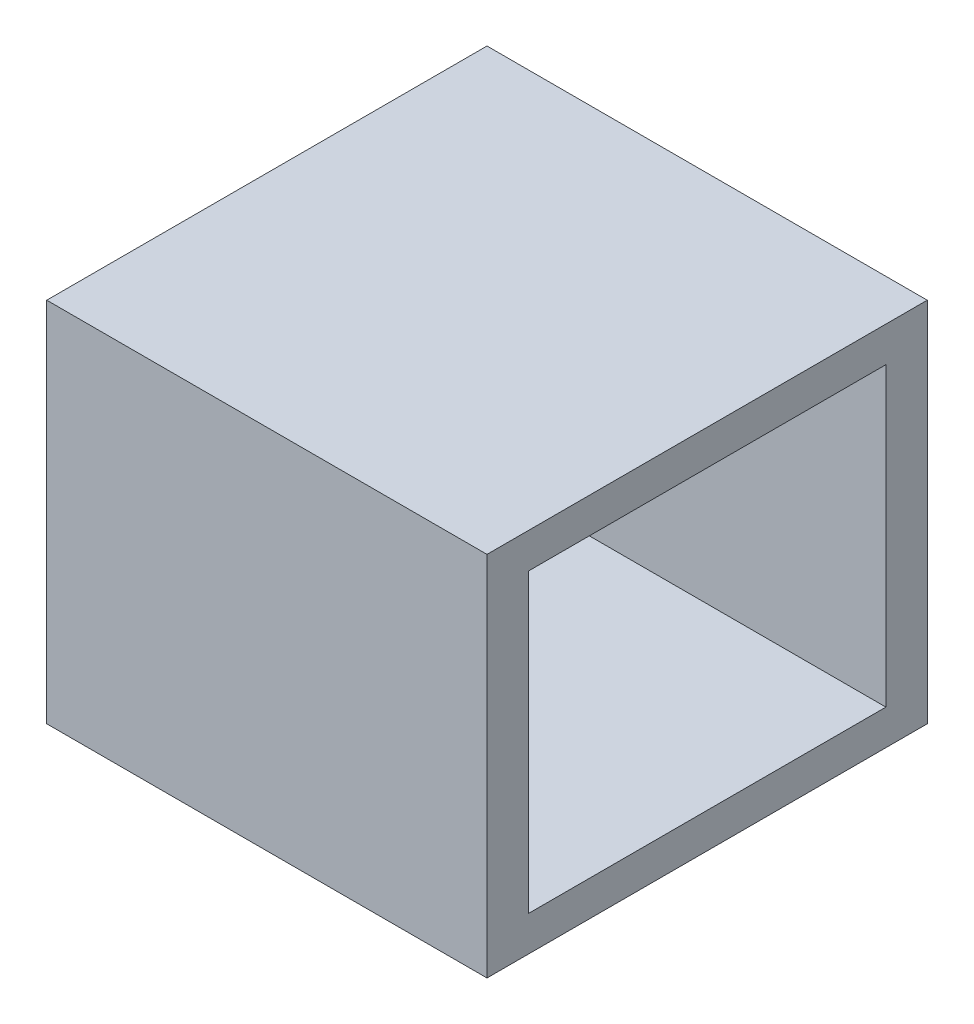
ISO-10303-21;
HEADER;
FILE_DESCRIPTION(('STEP AP214'),'2;1');
FILE_NAME('part.step','',(''),(''),'','','');
FILE_SCHEMA(('AUTOMOTIVE_DESIGN { 1 0 10303 214 1 1 1 1 }'));
ENDSEC;
DATA;
#1=APPLICATION_CONTEXT('core data for automotive mechanical design processes');
#2=APPLICATION_PROTOCOL_DEFINITION('international standard','automotive_design',2000,#1);
#3=PRODUCT_CONTEXT('',#1,'mechanical');
#4=PRODUCT('Part','Part','',(#3));
#5=PRODUCT_RELATED_PRODUCT_CATEGORY('part','',(#4));
#6=PRODUCT_DEFINITION_FORMATION('','',#4);
#7=PRODUCT_DEFINITION_CONTEXT('part definition',#1,'design');
#8=PRODUCT_DEFINITION('design','',#6,#7);
#9=PRODUCT_DEFINITION_SHAPE('','',#8);
#10=(LENGTH_UNIT() NAMED_UNIT(*) SI_UNIT(.MILLI.,.METRE.));
#11=(NAMED_UNIT(*) PLANE_ANGLE_UNIT() SI_UNIT($,.RADIAN.));
#12=(NAMED_UNIT(*) SI_UNIT($,.STERADIAN.) SOLID_ANGLE_UNIT());
#13=UNCERTAINTY_MEASURE_WITH_UNIT(LENGTH_MEASURE(1.E-05),#10,'distance_accuracy_value','');
#14=(GEOMETRIC_REPRESENTATION_CONTEXT(3) GLOBAL_UNCERTAINTY_ASSIGNED_CONTEXT((#13)) GLOBAL_UNIT_ASSIGNED_CONTEXT((#10,
#11,#12)) REPRESENTATION_CONTEXT('',''));
#15=CARTESIAN_POINT('',(0.,0.,0.));
#16=DIRECTION('',(0.,0.,1.));
#17=DIRECTION('',(1.,0.,0.));
#18=AXIS2_PLACEMENT_3D('',#15,#16,#17);
#19=CARTESIAN_POINT('',(76.2,-63.5,76.2));
#20=DIRECTION('',(-1.,0.,0.));
#21=DIRECTION('',(0.,0.,1.));
#22=AXIS2_PLACEMENT_3D('',#19,#20,#21);
#23=PLANE('',#22);
#24=DIRECTION('',(0.,0.,1.));
#25=VECTOR('',#24,1.);
#26=CARTESIAN_POINT('',(76.2,51.3319522360152,61.884513845509));
#27=LINE('',#26,#25);
#28=CARTESIAN_POINT('',(76.2,51.3319522360152,-61.884513845509));
#29=VERTEX_POINT('',#28);
#30=CARTESIAN_POINT('',(76.2,51.3319522360152,61.884513845509));
#31=VERTEX_POINT('',#30);
#32=EDGE_CURVE('E124',#29,#31,#27,.T.);
#33=ORIENTED_EDGE('',*,*,#32,.F.);
#34=DIRECTION('',(0.,1.,0.));
#35=VECTOR('',#34,1.);
#36=CARTESIAN_POINT('',(76.2,-51.3319522360152,-61.884513845509));
#37=LINE('',#36,#35);
#38=CARTESIAN_POINT('',(76.2,-51.3319522360152,-61.884513845509));
#39=VERTEX_POINT('',#38);
#40=EDGE_CURVE('E47',#39,#29,#37,.T.);
#41=ORIENTED_EDGE('',*,*,#40,.F.);
#42=DIRECTION('',(0.,0.,-1.));
#43=VECTOR('',#42,1.);
#44=CARTESIAN_POINT('',(76.2,-51.3319522360152,61.884513845509));
#45=LINE('',#44,#43);
#46=CARTESIAN_POINT('',(76.2,-51.3319522360152,61.884513845509));
#47=VERTEX_POINT('',#46);
#48=EDGE_CURVE('E115',#47,#39,#45,.T.);
#49=ORIENTED_EDGE('',*,*,#48,.F.);
#50=DIRECTION('',(0.,-1.,0.));
#51=VECTOR('',#50,1.);
#52=CARTESIAN_POINT('',(76.2,-51.3319522360152,61.884513845509));
#53=LINE('',#52,#51);
#54=EDGE_CURVE('E118',#31,#47,#53,.T.);
#55=ORIENTED_EDGE('',*,*,#54,.F.);
#56=EDGE_LOOP('',(#33,#41,#49,#55));
#57=FACE_BOUND('',#56,.T.);
#58=DIRECTION('',(0.,1.,0.));
#59=VECTOR('',#58,1.);
#60=CARTESIAN_POINT('',(76.2,-63.5,-76.2));
#61=LINE('',#60,#59);
#62=CARTESIAN_POINT('',(76.2,-63.5,-76.2));
#63=VERTEX_POINT('',#62);
#64=CARTESIAN_POINT('',(76.2,63.5,-76.2));
#65=VERTEX_POINT('',#64);
#66=EDGE_CURVE('E130',#63,#65,#61,.T.);
#67=ORIENTED_EDGE('',*,*,#66,.T.);
#68=DIRECTION('',(0.,0.,-1.));
#69=VECTOR('',#68,1.);
#70=CARTESIAN_POINT('',(76.2,63.5,76.2));
#71=LINE('',#70,#69);
#72=CARTESIAN_POINT('',(76.2,63.5,76.2));
#73=VERTEX_POINT('',#72);
#74=EDGE_CURVE('E11',#73,#65,#71,.T.);
#75=ORIENTED_EDGE('',*,*,#74,.F.);
#76=DIRECTION('',(0.,1.,0.));
#77=VECTOR('',#76,1.);
#78=CARTESIAN_POINT('',(76.2,-63.5,76.2));
#79=LINE('',#78,#77);
#80=CARTESIAN_POINT('',(76.2,-63.5,76.2));
#81=VERTEX_POINT('',#80);
#82=EDGE_CURVE('E134',#81,#73,#79,.T.);
#83=ORIENTED_EDGE('',*,*,#82,.F.);
#84=DIRECTION('',(0.,0.,-1.));
#85=VECTOR('',#84,1.);
#86=CARTESIAN_POINT('',(76.2,-63.5,76.2));
#87=LINE('',#86,#85);
#88=EDGE_CURVE('E144',#81,#63,#87,.T.);
#89=ORIENTED_EDGE('',*,*,#88,.T.);
#90=EDGE_LOOP('',(#67,#75,#83,#89));
#91=FACE_BOUND('',#90,.T.);
#92=ADVANCED_FACE('F33',(#57,#91),#23,.F.);
#93=CARTESIAN_POINT('',(-76.2,63.5,76.2));
#94=DIRECTION('',(0.,-1.,0.));
#95=DIRECTION('',(0.,0.,-1.));
#96=AXIS2_PLACEMENT_3D('',#93,#94,#95);
#97=PLANE('',#96);
#98=DIRECTION('',(-1.,0.,0.));
#99=VECTOR('',#98,1.);
#100=CARTESIAN_POINT('',(-76.2,63.5,-76.2));
#101=LINE('',#100,#99);
#102=CARTESIAN_POINT('',(-76.2,63.5,-76.2));
#103=VERTEX_POINT('',#102);
#104=EDGE_CURVE('E147',#65,#103,#101,.T.);
#105=ORIENTED_EDGE('',*,*,#104,.T.);
#106=DIRECTION('',(0.,0.,-1.));
#107=VECTOR('',#106,1.);
#108=CARTESIAN_POINT('',(-76.2,63.5,76.2));
#109=LINE('',#108,#107);
#110=CARTESIAN_POINT('',(-76.2,63.5,76.2));
#111=VERTEX_POINT('',#110);
#112=EDGE_CURVE('E40',#111,#103,#109,.T.);
#113=ORIENTED_EDGE('',*,*,#112,.F.);
#114=DIRECTION('',(-1.,0.,0.));
#115=VECTOR('',#114,1.);
#116=CARTESIAN_POINT('',(-76.2,63.5,76.2));
#117=LINE('',#116,#115);
#118=EDGE_CURVE('E137',#73,#111,#117,.T.);
#119=ORIENTED_EDGE('',*,*,#118,.F.);
#120=ORIENTED_EDGE('',*,*,#74,.T.);
#121=EDGE_LOOP('',(#105,#113,#119,#120));
#122=FACE_BOUND('',#121,.T.);
#123=ADVANCED_FACE('F175',(#122),#97,.F.);
#124=CARTESIAN_POINT('',(-76.2,-63.5,76.2));
#125=DIRECTION('',(1.,0.,0.));
#126=DIRECTION('',(0.,0.,-1.));
#127=AXIS2_PLACEMENT_3D('',#124,#125,#126);
#128=PLANE('',#127);
#129=DIRECTION('',(0.,0.,-1.));
#130=VECTOR('',#129,1.);
#131=CARTESIAN_POINT('',(-76.2,-51.3319522360152,61.884513845509));
#132=LINE('',#131,#130);
#133=CARTESIAN_POINT('',(-76.2,-51.3319522360152,61.884513845509));
#134=VERTEX_POINT('',#133);
#135=CARTESIAN_POINT('',(-76.2,-51.3319522360152,-61.884513845509));
#136=VERTEX_POINT('',#135);
#137=EDGE_CURVE('E105',#134,#136,#132,.T.);
#138=ORIENTED_EDGE('',*,*,#137,.T.);
#139=DIRECTION('',(0.,1.,0.));
#140=VECTOR('',#139,1.);
#141=CARTESIAN_POINT('',(-76.2,-51.3319522360152,-61.884513845509));
#142=LINE('',#141,#140);
#143=CARTESIAN_POINT('',(-76.2,51.3319522360152,-61.884513845509));
#144=VERTEX_POINT('',#143);
#145=EDGE_CURVE('E99',#136,#144,#142,.T.);
#146=ORIENTED_EDGE('',*,*,#145,.T.);
#147=DIRECTION('',(0.,0.,1.));
#148=VECTOR('',#147,1.);
#149=CARTESIAN_POINT('',(-76.2,51.3319522360152,61.884513845509));
#150=LINE('',#149,#148);
#151=CARTESIAN_POINT('',(-76.2,51.3319522360152,61.884513845509));
#152=VERTEX_POINT('',#151);
#153=EDGE_CURVE('E108',#144,#152,#150,.T.);
#154=ORIENTED_EDGE('',*,*,#153,.T.);
#155=DIRECTION('',(0.,-1.,0.));
#156=VECTOR('',#155,1.);
#157=CARTESIAN_POINT('',(-76.2,-51.3319522360152,61.884513845509));
#158=LINE('',#157,#156);
#159=EDGE_CURVE('E55',#152,#134,#158,.T.);
#160=ORIENTED_EDGE('',*,*,#159,.T.);
#161=EDGE_LOOP('',(#138,#146,#154,#160));
#162=FACE_BOUND('',#161,.T.);
#163=DIRECTION('',(0.,-1.,0.));
#164=VECTOR('',#163,1.);
#165=CARTESIAN_POINT('',(-76.2,-63.5,-76.2));
#166=LINE('',#165,#164);
#167=CARTESIAN_POINT('',(-76.2,-63.5,-76.2));
#168=VERTEX_POINT('',#167);
#169=EDGE_CURVE('E149',#103,#168,#166,.T.);
#170=ORIENTED_EDGE('',*,*,#169,.T.);
#171=DIRECTION('',(0.,0.,-1.));
#172=VECTOR('',#171,1.);
#173=CARTESIAN_POINT('',(-76.2,-63.5,76.2));
#174=LINE('',#173,#172);
#175=CARTESIAN_POINT('',(-76.2,-63.5,76.2));
#176=VERTEX_POINT('',#175);
#177=EDGE_CURVE('E154',#176,#168,#174,.T.);
#178=ORIENTED_EDGE('',*,*,#177,.F.);
#179=DIRECTION('',(0.,-1.,0.));
#180=VECTOR('',#179,1.);
#181=CARTESIAN_POINT('',(-76.2,-63.5,76.2));
#182=LINE('',#181,#180);
#183=EDGE_CURVE('E140',#111,#176,#182,.T.);
#184=ORIENTED_EDGE('',*,*,#183,.F.);
#185=ORIENTED_EDGE('',*,*,#112,.T.);
#186=EDGE_LOOP('',(#170,#178,#184,#185));
#187=FACE_BOUND('',#186,.T.);
#188=ADVANCED_FACE('F112',(#162,#187),#128,.F.);
#189=CARTESIAN_POINT('',(-76.2,-63.5,76.2));
#190=DIRECTION('',(0.,1.,0.));
#191=DIRECTION('',(0.,0.,1.));
#192=AXIS2_PLACEMENT_3D('',#189,#190,#191);
#193=PLANE('',#192);
#194=DIRECTION('',(1.,0.,0.));
#195=VECTOR('',#194,1.);
#196=CARTESIAN_POINT('',(-76.2,-63.5,-76.2));
#197=LINE('',#196,#195);
#198=EDGE_CURVE('E138',#168,#63,#197,.T.);
#199=ORIENTED_EDGE('',*,*,#198,.T.);
#200=ORIENTED_EDGE('',*,*,#88,.F.);
#201=DIRECTION('',(1.,0.,0.));
#202=VECTOR('',#201,1.);
#203=CARTESIAN_POINT('',(-76.2,-63.5,76.2));
#204=LINE('',#203,#202);
#205=EDGE_CURVE('E142',#176,#81,#204,.T.);
#206=ORIENTED_EDGE('',*,*,#205,.F.);
#207=ORIENTED_EDGE('',*,*,#177,.T.);
#208=EDGE_LOOP('',(#199,#200,#206,#207));
#209=FACE_BOUND('',#208,.T.);
#210=ADVANCED_FACE('F168',(#209),#193,.F.);
#211=CARTESIAN_POINT('',(0.,0.,76.2));
#212=DIRECTION('',(0.,0.,-1.));
#213=DIRECTION('',(-1.,0.,0.));
#214=AXIS2_PLACEMENT_3D('',#211,#212,#213);
#215=PLANE('',#214);
#216=ORIENTED_EDGE('',*,*,#82,.T.);
#217=ORIENTED_EDGE('',*,*,#118,.T.);
#218=ORIENTED_EDGE('',*,*,#183,.T.);
#219=ORIENTED_EDGE('',*,*,#205,.T.);
#220=EDGE_LOOP('',(#216,#217,#218,#219));
#221=FACE_BOUND('',#220,.T.);
#222=ADVANCED_FACE('F174',(#221),#215,.F.);
#223=CARTESIAN_POINT('',(0.,0.,-76.2));
#224=DIRECTION('',(0.,0.,-1.));
#225=DIRECTION('',(-1.,0.,0.));
#226=AXIS2_PLACEMENT_3D('',#223,#224,#225);
#227=PLANE('',#226);
#228=ORIENTED_EDGE('',*,*,#66,.F.);
#229=ORIENTED_EDGE('',*,*,#198,.F.);
#230=ORIENTED_EDGE('',*,*,#169,.F.);
#231=ORIENTED_EDGE('',*,*,#104,.F.);
#232=EDGE_LOOP('',(#228,#229,#230,#231));
#233=FACE_BOUND('',#232,.T.);
#234=ADVANCED_FACE('F165',(#233),#227,.T.);
#235=CARTESIAN_POINT('',(-76.2,-51.3319522360152,-61.884513845509));
#236=DIRECTION('',(0.,0.,-1.));
#237=DIRECTION('',(-1.,0.,0.));
#238=AXIS2_PLACEMENT_3D('',#235,#236,#237);
#239=PLANE('',#238);
#240=ORIENTED_EDGE('',*,*,#40,.T.);
#241=DIRECTION('',(1.,0.,0.));
#242=VECTOR('',#241,1.);
#243=CARTESIAN_POINT('',(-76.2,51.3319522360152,-61.884513845509));
#244=LINE('',#243,#242);
#245=EDGE_CURVE('E95',#144,#29,#244,.T.);
#246=ORIENTED_EDGE('',*,*,#245,.F.);
#247=ORIENTED_EDGE('',*,*,#145,.F.);
#248=DIRECTION('',(1.,0.,0.));
#249=VECTOR('',#248,1.);
#250=CARTESIAN_POINT('',(-76.2,-51.3319522360152,-61.884513845509));
#251=LINE('',#250,#249);
#252=EDGE_CURVE('E128',#136,#39,#251,.T.);
#253=ORIENTED_EDGE('',*,*,#252,.T.);
#254=EDGE_LOOP('',(#240,#246,#247,#253));
#255=FACE_BOUND('',#254,.T.);
#256=ADVANCED_FACE('F97',(#255),#239,.F.);
#257=CARTESIAN_POINT('',(-76.2,-51.3319522360152,61.884513845509));
#258=DIRECTION('',(0.,-1.,0.));
#259=DIRECTION('',(0.,0.,-1.));
#260=AXIS2_PLACEMENT_3D('',#257,#258,#259);
#261=PLANE('',#260);
#262=ORIENTED_EDGE('',*,*,#48,.T.);
#263=ORIENTED_EDGE('',*,*,#252,.F.);
#264=ORIENTED_EDGE('',*,*,#137,.F.);
#265=DIRECTION('',(1.,0.,0.));
#266=VECTOR('',#265,1.);
#267=CARTESIAN_POINT('',(-76.2,-51.3319522360152,61.884513845509));
#268=LINE('',#267,#266);
#269=EDGE_CURVE('E131',#134,#47,#268,.T.);
#270=ORIENTED_EDGE('',*,*,#269,.T.);
#271=EDGE_LOOP('',(#262,#263,#264,#270));
#272=FACE_BOUND('',#271,.T.);
#273=ADVANCED_FACE('F192',(#272),#261,.F.);
#274=CARTESIAN_POINT('',(-76.2,-51.3319522360152,61.884513845509));
#275=DIRECTION('',(0.,0.,1.));
#276=DIRECTION('',(1.,0.,0.));
#277=AXIS2_PLACEMENT_3D('',#274,#275,#276);
#278=PLANE('',#277);
#279=ORIENTED_EDGE('',*,*,#54,.T.);
#280=ORIENTED_EDGE('',*,*,#269,.F.);
#281=ORIENTED_EDGE('',*,*,#159,.F.);
#282=DIRECTION('',(1.,0.,0.));
#283=VECTOR('',#282,1.);
#284=CARTESIAN_POINT('',(-76.2,51.3319522360152,61.884513845509));
#285=LINE('',#284,#283);
#286=EDGE_CURVE('E104',#152,#31,#285,.T.);
#287=ORIENTED_EDGE('',*,*,#286,.T.);
#288=EDGE_LOOP('',(#279,#280,#281,#287));
#289=FACE_BOUND('',#288,.T.);
#290=ADVANCED_FACE('F195',(#289),#278,.F.);
#291=CARTESIAN_POINT('',(-76.2,51.3319522360152,61.884513845509));
#292=DIRECTION('',(0.,1.,0.));
#293=DIRECTION('',(0.,0.,1.));
#294=AXIS2_PLACEMENT_3D('',#291,#292,#293);
#295=PLANE('',#294);
#296=ORIENTED_EDGE('',*,*,#32,.T.);
#297=ORIENTED_EDGE('',*,*,#286,.F.);
#298=ORIENTED_EDGE('',*,*,#153,.F.);
#299=ORIENTED_EDGE('',*,*,#245,.T.);
#300=EDGE_LOOP('',(#296,#297,#298,#299));
#301=FACE_BOUND('',#300,.T.);
#302=ADVANCED_FACE('F109',(#301),#295,.F.);
#303=CLOSED_SHELL('',(#92,#123,#188,#210,#222,#234,#256,#273,#290,#302));
#304=MANIFOLD_SOLID_BREP('B2',#303);
#305=ADVANCED_BREP_SHAPE_REPRESENTATION('',(#18,#304),#14);
#306=SHAPE_DEFINITION_REPRESENTATION(#9,#305);
ENDSEC;
END-ISO-10303-21;
